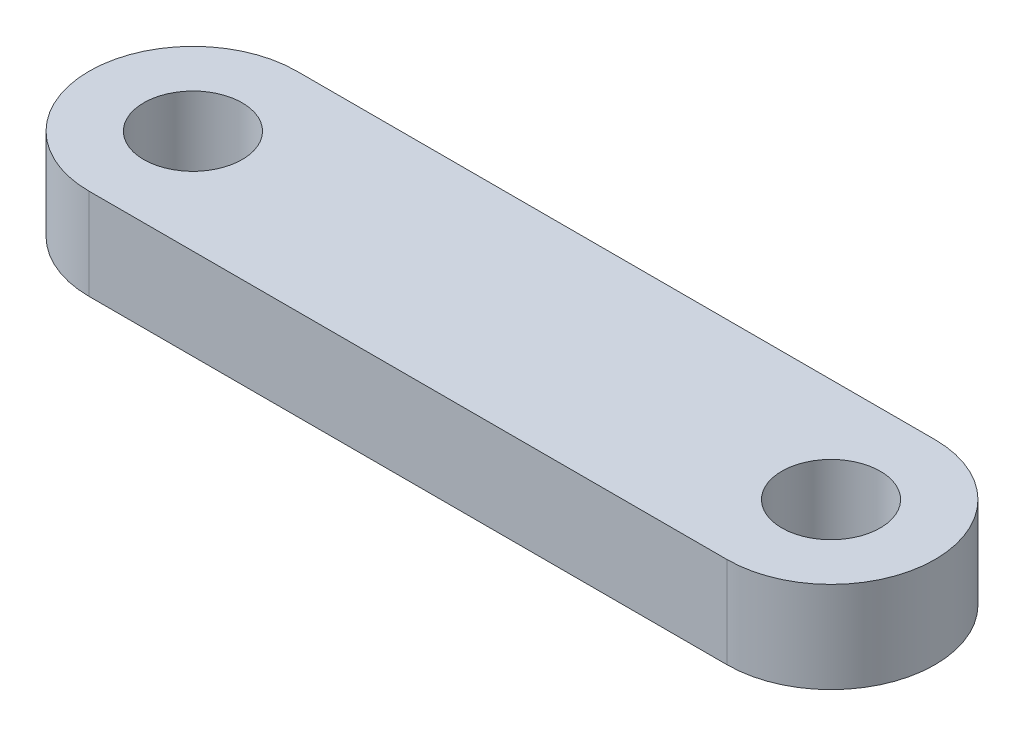
ISO-10303-21;
HEADER;
FILE_DESCRIPTION(('STEP AP214'),'2;1');
FILE_NAME('part.step','',(''),(''),'','','');
FILE_SCHEMA(('AUTOMOTIVE_DESIGN { 1 0 10303 214 1 1 1 1 }'));
ENDSEC;
DATA;
#1=APPLICATION_CONTEXT('core data for automotive mechanical design processes');
#2=APPLICATION_PROTOCOL_DEFINITION('international standard','automotive_design',2000,#1);
#3=PRODUCT_CONTEXT('',#1,'mechanical');
#4=PRODUCT('Part','Part','',(#3));
#5=PRODUCT_RELATED_PRODUCT_CATEGORY('part','',(#4));
#6=PRODUCT_DEFINITION_FORMATION('','',#4);
#7=PRODUCT_DEFINITION_CONTEXT('part definition',#1,'design');
#8=PRODUCT_DEFINITION('design','',#6,#7);
#9=PRODUCT_DEFINITION_SHAPE('','',#8);
#10=(LENGTH_UNIT() NAMED_UNIT(*) SI_UNIT(.MILLI.,.METRE.));
#11=(NAMED_UNIT(*) PLANE_ANGLE_UNIT() SI_UNIT($,.RADIAN.));
#12=(NAMED_UNIT(*) SI_UNIT($,.STERADIAN.) SOLID_ANGLE_UNIT());
#13=UNCERTAINTY_MEASURE_WITH_UNIT(LENGTH_MEASURE(1.E-05),#10,'distance_accuracy_value','');
#14=(GEOMETRIC_REPRESENTATION_CONTEXT(3) GLOBAL_UNCERTAINTY_ASSIGNED_CONTEXT((#13)) GLOBAL_UNIT_ASSIGNED_CONTEXT((#10,
#11,#12)) REPRESENTATION_CONTEXT('',''));
#15=CARTESIAN_POINT('',(0.,0.,0.));
#16=DIRECTION('',(0.,0.,1.));
#17=DIRECTION('',(1.,0.,0.));
#18=AXIS2_PLACEMENT_3D('',#15,#16,#17);
#19=CARTESIAN_POINT('',(0.,5.,-8.0199823253245));
#20=DIRECTION('',(0.,0.,-1.));
#21=DIRECTION('',(-1.,0.,0.));
#22=AXIS2_PLACEMENT_3D('',#19,#20,#21);
#23=PLANE('',#22);
#24=DIRECTION('',(1.,0.,0.));
#25=VECTOR('',#24,1.);
#26=CARTESIAN_POINT('',(0.,0.,-8.0199823253245));
#27=LINE('',#26,#25);
#28=CARTESIAN_POINT('',(-32.3199823253245,0.,-8.0199823253245));
#29=VERTEX_POINT('',#28);
#30=CARTESIAN_POINT('',(2.68001767467546,0.,-8.0199823253245));
#31=VERTEX_POINT('',#30);
#32=EDGE_CURVE('E129',#29,#31,#27,.T.);
#33=ORIENTED_EDGE('',*,*,#32,.F.);
#34=DIRECTION('',(0.,-1.,0.));
#35=VECTOR('',#34,1.);
#36=CARTESIAN_POINT('',(-32.3199823253245,5.,-8.0199823253245));
#37=LINE('',#36,#35);
#38=CARTESIAN_POINT('',(-32.3199823253245,5.,-8.0199823253245));
#39=VERTEX_POINT('',#38);
#40=EDGE_CURVE('E11',#39,#29,#37,.T.);
#41=ORIENTED_EDGE('',*,*,#40,.F.);
#42=DIRECTION('',(1.,0.,0.));
#43=VECTOR('',#42,1.);
#44=CARTESIAN_POINT('',(0.,5.,-8.0199823253245));
#45=LINE('',#44,#43);
#46=CARTESIAN_POINT('',(2.68001767467546,5.,-8.0199823253245));
#47=VERTEX_POINT('',#46);
#48=EDGE_CURVE('E103',#39,#47,#45,.T.);
#49=ORIENTED_EDGE('',*,*,#48,.T.);
#50=DIRECTION('',(0.,-1.,0.));
#51=VECTOR('',#50,1.);
#52=CARTESIAN_POINT('',(2.68001767467546,5.,-8.0199823253245));
#53=LINE('',#52,#51);
#54=EDGE_CURVE('E83',#47,#31,#53,.T.);
#55=ORIENTED_EDGE('',*,*,#54,.T.);
#56=EDGE_LOOP('',(#33,#41,#49,#55));
#57=FACE_BOUND('',#56,.T.);
#58=ADVANCED_FACE('F43',(#57),#23,.T.);
#59=CARTESIAN_POINT('',(-32.3199823253245,5.,-2.3199823253245));
#60=DIRECTION('',(0.,-1.,0.));
#61=DIRECTION('',(0.,0.,-1.));
#62=AXIS2_PLACEMENT_3D('',#59,#60,#61);
#63=CYLINDRICAL_SURFACE('',#62,5.7);
#64=CARTESIAN_POINT('',(-32.3199823253245,0.,-2.3199823253245));
#65=DIRECTION('',(0.,1.,0.));
#66=DIRECTION('',(0.,0.,1.));
#67=AXIS2_PLACEMENT_3D('',#64,#65,#66);
#68=CIRCLE('',#67,5.7);
#69=CARTESIAN_POINT('',(-32.3199823253245,0.,3.3800176746755));
#70=VERTEX_POINT('',#69);
#71=EDGE_CURVE('E109',#29,#70,#68,.T.);
#72=ORIENTED_EDGE('',*,*,#71,.T.);
#73=DIRECTION('',(0.,-1.,0.));
#74=VECTOR('',#73,1.);
#75=CARTESIAN_POINT('',(-32.3199823253245,5.,3.3800176746755));
#76=LINE('',#75,#74);
#77=CARTESIAN_POINT('',(-32.3199823253245,5.,3.3800176746755));
#78=VERTEX_POINT('',#77);
#79=EDGE_CURVE('E53',#78,#70,#76,.T.);
#80=ORIENTED_EDGE('',*,*,#79,.F.);
#81=CARTESIAN_POINT('',(-32.3199823253245,5.,-2.3199823253245));
#82=DIRECTION('',(0.,1.,0.));
#83=DIRECTION('',(0.,0.,1.));
#84=AXIS2_PLACEMENT_3D('',#81,#82,#83);
#85=CIRCLE('',#84,5.7);
#86=EDGE_CURVE('E99',#39,#78,#85,.T.);
#87=ORIENTED_EDGE('',*,*,#86,.F.);
#88=ORIENTED_EDGE('',*,*,#40,.T.);
#89=EDGE_LOOP('',(#72,#80,#87,#88));
#90=FACE_BOUND('',#89,.T.);
#91=ADVANCED_FACE('F107',(#90),#63,.T.);
#92=CARTESIAN_POINT('',(0.,5.,3.3800176746755));
#93=DIRECTION('',(0.,0.,-1.));
#94=DIRECTION('',(-1.,0.,0.));
#95=AXIS2_PLACEMENT_3D('',#92,#93,#94);
#96=PLANE('',#95);
#97=DIRECTION('',(1.,0.,0.));
#98=VECTOR('',#97,1.);
#99=CARTESIAN_POINT('',(0.,0.,3.3800176746755));
#100=LINE('',#99,#98);
#101=CARTESIAN_POINT('',(2.68001767467546,0.,3.3800176746755));
#102=VERTEX_POINT('',#101);
#103=EDGE_CURVE('E124',#70,#102,#100,.T.);
#104=ORIENTED_EDGE('',*,*,#103,.T.);
#105=DIRECTION('',(0.,-1.,0.));
#106=VECTOR('',#105,1.);
#107=CARTESIAN_POINT('',(2.68001767467546,5.,3.3800176746755));
#108=LINE('',#107,#106);
#109=CARTESIAN_POINT('',(2.68001767467546,5.,3.3800176746755));
#110=VERTEX_POINT('',#109);
#111=EDGE_CURVE('E97',#110,#102,#108,.T.);
#112=ORIENTED_EDGE('',*,*,#111,.F.);
#113=DIRECTION('',(1.,0.,0.));
#114=VECTOR('',#113,1.);
#115=CARTESIAN_POINT('',(0.,5.,3.3800176746755));
#116=LINE('',#115,#114);
#117=EDGE_CURVE('E91',#78,#110,#116,.T.);
#118=ORIENTED_EDGE('',*,*,#117,.F.);
#119=ORIENTED_EDGE('',*,*,#79,.T.);
#120=EDGE_LOOP('',(#104,#112,#118,#119));
#121=FACE_BOUND('',#120,.T.);
#122=ADVANCED_FACE('F94',(#121),#96,.F.);
#123=CARTESIAN_POINT('',(2.68001767467546,5.,-2.3199823253245));
#124=DIRECTION('',(0.,-1.,0.));
#125=DIRECTION('',(0.,0.,-1.));
#126=AXIS2_PLACEMENT_3D('',#123,#124,#125);
#127=CYLINDRICAL_SURFACE('',#126,5.7);
#128=CARTESIAN_POINT('',(2.68001767467546,0.,-2.3199823253245));
#129=DIRECTION('',(0.,1.,0.));
#130=DIRECTION('',(0.,0.,1.));
#131=AXIS2_PLACEMENT_3D('',#128,#129,#130);
#132=CIRCLE('',#131,5.7);
#133=EDGE_CURVE('E76',#102,#31,#132,.T.);
#134=ORIENTED_EDGE('',*,*,#133,.T.);
#135=ORIENTED_EDGE('',*,*,#54,.F.);
#136=CARTESIAN_POINT('',(2.68001767467546,5.,-2.3199823253245));
#137=DIRECTION('',(0.,1.,0.));
#138=DIRECTION('',(0.,0.,1.));
#139=AXIS2_PLACEMENT_3D('',#136,#137,#138);
#140=CIRCLE('',#139,5.7);
#141=EDGE_CURVE('E61',#110,#47,#140,.T.);
#142=ORIENTED_EDGE('',*,*,#141,.F.);
#143=ORIENTED_EDGE('',*,*,#111,.T.);
#144=EDGE_LOOP('',(#134,#135,#142,#143));
#145=FACE_BOUND('',#144,.T.);
#146=ADVANCED_FACE('F169',(#145),#127,.T.);
#147=CARTESIAN_POINT('',(2.68001767467546,5.,-2.3199823253245));
#148=DIRECTION('',(0.,-1.,0.));
#149=DIRECTION('',(0.,0.,-1.));
#150=AXIS2_PLACEMENT_3D('',#147,#148,#149);
#151=CYLINDRICAL_SURFACE('',#150,2.7);
#152=CARTESIAN_POINT('',(2.68001767467546,5.,-2.3199823253245));
#153=DIRECTION('',(0.,1.,0.));
#154=DIRECTION('',(0.,0.,1.));
#155=AXIS2_PLACEMENT_3D('',#152,#153,#154);
#156=CIRCLE('',#155,2.7);
#157=CARTESIAN_POINT('',(2.68001767467546,5.,0.380017674675499));
#158=VERTEX_POINT('',#157);
#159=EDGE_CURVE('E121',#158,#158,#156,.T.);
#160=ORIENTED_EDGE('',*,*,#159,.T.);
#161=EDGE_LOOP('',(#160));
#162=FACE_BOUND('',#161,.T.);
#163=CARTESIAN_POINT('',(2.68001767467546,0.,-2.3199823253245));
#164=DIRECTION('',(0.,1.,0.));
#165=DIRECTION('',(0.,0.,1.));
#166=AXIS2_PLACEMENT_3D('',#163,#164,#165);
#167=CIRCLE('',#166,2.7);
#168=CARTESIAN_POINT('',(2.68001767467546,0.,0.380017674675499));
#169=VERTEX_POINT('',#168);
#170=EDGE_CURVE('E132',#169,#169,#167,.T.);
#171=ORIENTED_EDGE('',*,*,#170,.F.);
#172=EDGE_LOOP('',(#171));
#173=FACE_BOUND('',#172,.T.);
#174=ADVANCED_FACE('F45',(#162,#173),#151,.F.);
#175=CARTESIAN_POINT('',(-32.3199823253245,5.,-2.3199823253245));
#176=DIRECTION('',(0.,-1.,0.));
#177=DIRECTION('',(0.,0.,-1.));
#178=AXIS2_PLACEMENT_3D('',#175,#176,#177);
#179=CYLINDRICAL_SURFACE('',#178,2.7);
#180=CARTESIAN_POINT('',(-32.3199823253245,5.,-2.3199823253245));
#181=DIRECTION('',(0.,1.,0.));
#182=DIRECTION('',(0.,0.,1.));
#183=AXIS2_PLACEMENT_3D('',#180,#181,#182);
#184=CIRCLE('',#183,2.7);
#185=CARTESIAN_POINT('',(-32.3199823253245,5.,0.380017674675501));
#186=VERTEX_POINT('',#185);
#187=EDGE_CURVE('E116',#186,#186,#184,.T.);
#188=ORIENTED_EDGE('',*,*,#187,.T.);
#189=EDGE_LOOP('',(#188));
#190=FACE_BOUND('',#189,.T.);
#191=CARTESIAN_POINT('',(-32.3199823253245,0.,-2.3199823253245));
#192=DIRECTION('',(0.,1.,0.));
#193=DIRECTION('',(0.,0.,1.));
#194=AXIS2_PLACEMENT_3D('',#191,#192,#193);
#195=CIRCLE('',#194,2.7);
#196=CARTESIAN_POINT('',(-32.3199823253245,0.,0.380017674675501));
#197=VERTEX_POINT('',#196);
#198=EDGE_CURVE('E117',#197,#197,#195,.T.);
#199=ORIENTED_EDGE('',*,*,#198,.F.);
#200=EDGE_LOOP('',(#199));
#201=FACE_BOUND('',#200,.T.);
#202=ADVANCED_FACE('F151',(#190,#201),#179,.F.);
#203=CARTESIAN_POINT('',(0.,5.,0.));
#204=DIRECTION('',(0.,1.,0.));
#205=DIRECTION('',(0.,0.,1.));
#206=AXIS2_PLACEMENT_3D('',#203,#204,#205);
#207=PLANE('',#206);
#208=ORIENTED_EDGE('',*,*,#159,.F.);
#209=EDGE_LOOP('',(#208));
#210=FACE_BOUND('',#209,.T.);
#211=ORIENTED_EDGE('',*,*,#48,.F.);
#212=ORIENTED_EDGE('',*,*,#86,.T.);
#213=ORIENTED_EDGE('',*,*,#117,.T.);
#214=ORIENTED_EDGE('',*,*,#141,.T.);
#215=EDGE_LOOP('',(#211,#212,#213,#214));
#216=FACE_BOUND('',#215,.T.);
#217=ORIENTED_EDGE('',*,*,#187,.F.);
#218=EDGE_LOOP('',(#217));
#219=FACE_BOUND('',#218,.T.);
#220=ADVANCED_FACE('F101',(#210,#216,#219),#207,.T.);
#221=CARTESIAN_POINT('',(0.,0.,0.));
#222=DIRECTION('',(0.,1.,0.));
#223=DIRECTION('',(0.,0.,1.));
#224=AXIS2_PLACEMENT_3D('',#221,#222,#223);
#225=PLANE('',#224);
#226=ORIENTED_EDGE('',*,*,#170,.T.);
#227=EDGE_LOOP('',(#226));
#228=FACE_BOUND('',#227,.T.);
#229=ORIENTED_EDGE('',*,*,#32,.T.);
#230=ORIENTED_EDGE('',*,*,#133,.F.);
#231=ORIENTED_EDGE('',*,*,#103,.F.);
#232=ORIENTED_EDGE('',*,*,#71,.F.);
#233=EDGE_LOOP('',(#229,#230,#231,#232));
#234=FACE_BOUND('',#233,.T.);
#235=ORIENTED_EDGE('',*,*,#198,.T.);
#236=EDGE_LOOP('',(#235));
#237=FACE_BOUND('',#236,.T.);
#238=ADVANCED_FACE('F150',(#228,#234,#237),#225,.F.);
#239=CLOSED_SHELL('',(#58,#91,#122,#146,#174,#202,#220,#238));
#240=MANIFOLD_SOLID_BREP('B2',#239);
#241=ADVANCED_BREP_SHAPE_REPRESENTATION('',(#18,#240),#14);
#242=SHAPE_DEFINITION_REPRESENTATION(#9,#241);
ENDSEC;
END-ISO-10303-21;
